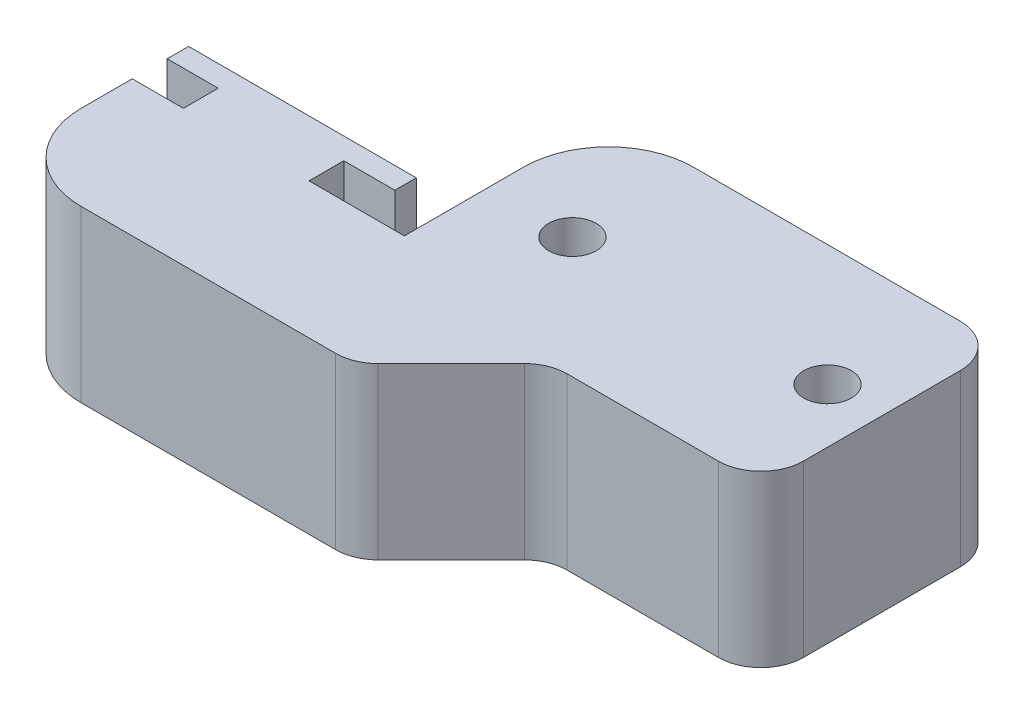
ISO-10303-21;
HEADER;
FILE_DESCRIPTION(('STEP AP214'),'2;1');
FILE_NAME('part.step','',(''),(''),'','','');
FILE_SCHEMA(('AUTOMOTIVE_DESIGN { 1 0 10303 214 1 1 1 1 }'));
ENDSEC;
DATA;
#1=APPLICATION_CONTEXT('core data for automotive mechanical design processes');
#2=APPLICATION_PROTOCOL_DEFINITION('international standard','automotive_design',2000,#1);
#3=PRODUCT_CONTEXT('',#1,'mechanical');
#4=PRODUCT('Part','Part','',(#3));
#5=PRODUCT_RELATED_PRODUCT_CATEGORY('part','',(#4));
#6=PRODUCT_DEFINITION_FORMATION('','',#4);
#7=PRODUCT_DEFINITION_CONTEXT('part definition',#1,'design');
#8=PRODUCT_DEFINITION('design','',#6,#7);
#9=PRODUCT_DEFINITION_SHAPE('','',#8);
#10=(LENGTH_UNIT() NAMED_UNIT(*) SI_UNIT(.MILLI.,.METRE.));
#11=(NAMED_UNIT(*) PLANE_ANGLE_UNIT() SI_UNIT($,.RADIAN.));
#12=(NAMED_UNIT(*) SI_UNIT($,.STERADIAN.) SOLID_ANGLE_UNIT());
#13=UNCERTAINTY_MEASURE_WITH_UNIT(LENGTH_MEASURE(1.E-05),#10,'distance_accuracy_value','');
#14=(GEOMETRIC_REPRESENTATION_CONTEXT(3) GLOBAL_UNCERTAINTY_ASSIGNED_CONTEXT((#13)) GLOBAL_UNIT_ASSIGNED_CONTEXT((#10,
#11,#12)) REPRESENTATION_CONTEXT('',''));
#15=CARTESIAN_POINT('',(0.,0.,0.));
#16=DIRECTION('',(0.,0.,1.));
#17=DIRECTION('',(1.,0.,0.));
#18=AXIS2_PLACEMENT_3D('',#15,#16,#17);
#19=CARTESIAN_POINT('',(-22.4210050080891,6.35,-2.9181600674867));
#20=DIRECTION('',(0.,1.,0.));
#21=DIRECTION('',(0.,0.,1.));
#22=AXIS2_PLACEMENT_3D('',#19,#20,#21);
#23=PLANE('',#22);
#24=CARTESIAN_POINT('',(-32.3905050080891,6.35,-5.85066017148669));
#25=DIRECTION('',(0.,1.,0.));
#26=DIRECTION('',(0.,0.,1.));
#27=AXIS2_PLACEMENT_3D('',#24,#25,#26);
#28=CIRCLE('',#27,0.889000000000003);
#29=CARTESIAN_POINT('',(-32.3905050080891,6.35,-4.96166017148668));
#30=VERTEX_POINT('',#29);
#31=EDGE_CURVE('E217',#30,#30,#28,.T.);
#32=ORIENTED_EDGE('',*,*,#31,.F.);
#33=EDGE_LOOP('',(#32));
#34=FACE_BOUND('',#33,.T.);
#35=CARTESIAN_POINT('',(-22.4210050080891,6.35,-2.9181600674867));
#36=DIRECTION('',(0.,1.,0.));
#37=DIRECTION('',(0.,0.,1.));
#38=AXIS2_PLACEMENT_3D('',#35,#36,#37);
#39=CIRCLE('',#38,1.5875);
#40=CARTESIAN_POINT('',(-22.4210050080891,6.35,-1.3306600674867));
#41=VERTEX_POINT('',#40);
#42=CARTESIAN_POINT('',(-20.8335050080891,6.35,-2.9181600674867));
#43=VERTEX_POINT('',#42);
#44=EDGE_CURVE('E256',#41,#43,#39,.T.);
#45=ORIENTED_EDGE('',*,*,#44,.T.);
#46=DIRECTION('',(0.,0.,-1.));
#47=VECTOR('',#46,1.);
#48=CARTESIAN_POINT('',(-20.8335050080891,6.35,-2.9181600674867));
#49=LINE('',#48,#47);
#50=CARTESIAN_POINT('',(-20.8335050080891,6.35,-8.7831601714867));
#51=VERTEX_POINT('',#50);
#52=EDGE_CURVE('E134',#43,#51,#49,.T.);
#53=ORIENTED_EDGE('',*,*,#52,.T.);
#54=CARTESIAN_POINT('',(-22.4210050080891,6.35,-8.7831601714867));
#55=DIRECTION('',(0.,1.,0.));
#56=DIRECTION('',(0.,0.,1.));
#57=AXIS2_PLACEMENT_3D('',#54,#55,#56);
#58=CIRCLE('',#57,1.5875);
#59=CARTESIAN_POINT('',(-22.4210050080891,6.35,-10.3706601714867));
#60=VERTEX_POINT('',#59);
#61=EDGE_CURVE('E313',#51,#60,#58,.T.);
#62=ORIENTED_EDGE('',*,*,#61,.T.);
#63=DIRECTION('',(-1.,0.,0.));
#64=VECTOR('',#63,1.);
#65=CARTESIAN_POINT('',(-32.3905050080891,6.35,-10.3706601714867));
#66=LINE('',#65,#64);
#67=CARTESIAN_POINT('',(-32.3905050080891,6.35,-10.3706601714867));
#68=VERTEX_POINT('',#67);
#69=EDGE_CURVE('E332',#60,#68,#66,.T.);
#70=ORIENTED_EDGE('',*,*,#69,.T.);
#71=CARTESIAN_POINT('',(-32.3905050080891,6.35,-7.19566017148671));
#72=DIRECTION('',(0.,1.,0.));
#73=DIRECTION('',(0.,0.,1.));
#74=AXIS2_PLACEMENT_3D('',#71,#72,#73);
#75=CIRCLE('',#74,3.175);
#76=CARTESIAN_POINT('',(-35.5655050080891,6.35,-7.19566017148671));
#77=VERTEX_POINT('',#76);
#78=EDGE_CURVE('E329',#68,#77,#75,.T.);
#79=ORIENTED_EDGE('',*,*,#78,.T.);
#80=DIRECTION('',(0.,0.,1.));
#81=VECTOR('',#80,1.);
#82=CARTESIAN_POINT('',(-35.5655050080891,6.35,-7.19566017148671));
#83=LINE('',#82,#81);
#84=CARTESIAN_POINT('',(-35.5655050080891,6.35,-2.7506601714867));
#85=VERTEX_POINT('',#84);
#86=EDGE_CURVE('E331',#77,#85,#83,.T.);
#87=ORIENTED_EDGE('',*,*,#86,.T.);
#88=DIRECTION('',(-1.,0.,0.));
#89=VECTOR('',#88,1.);
#90=CARTESIAN_POINT('',(-35.5655050080891,6.35,-2.7506601714867));
#91=LINE('',#90,#89);
#92=CARTESIAN_POINT('',(-39.1255050080891,6.35,-2.7506601714867));
#93=VERTEX_POINT('',#92);
#94=EDGE_CURVE('E334',#85,#93,#91,.T.);
#95=ORIENTED_EDGE('',*,*,#94,.T.);
#96=DIRECTION('',(0.,0.,-1.));
#97=VECTOR('',#96,1.);
#98=CARTESIAN_POINT('',(-39.1255050080891,6.35,-2.7506601714867));
#99=LINE('',#98,#97);
#100=CARTESIAN_POINT('',(-39.1255050080891,6.35,-4.0506601714867));
#101=VERTEX_POINT('',#100);
#102=EDGE_CURVE('E340',#93,#101,#99,.T.);
#103=ORIENTED_EDGE('',*,*,#102,.T.);
#104=DIRECTION('',(1.,0.,0.));
#105=VECTOR('',#104,1.);
#106=CARTESIAN_POINT('',(-37.2205050080891,6.35,-4.0506601714867));
#107=LINE('',#106,#105);
#108=CARTESIAN_POINT('',(-37.2205050080891,6.35,-4.0506601714867));
#109=VERTEX_POINT('',#108);
#110=EDGE_CURVE('E342',#101,#109,#107,.T.);
#111=ORIENTED_EDGE('',*,*,#110,.T.);
#112=DIRECTION('',(0.,0.,-1.));
#113=VECTOR('',#112,1.);
#114=CARTESIAN_POINT('',(-37.2205050080891,6.35,-4.0506601714867));
#115=LINE('',#114,#113);
#116=CARTESIAN_POINT('',(-37.2205050080891,6.35,-4.8506601714867));
#117=VERTEX_POINT('',#116);
#118=EDGE_CURVE('E344',#109,#117,#115,.T.);
#119=ORIENTED_EDGE('',*,*,#118,.T.);
#120=DIRECTION('',(-1.,0.,0.));
#121=VECTOR('',#120,1.);
#122=CARTESIAN_POINT('',(-37.2205050080891,6.35,-4.8506601714867));
#123=LINE('',#122,#121);
#124=CARTESIAN_POINT('',(-45.7205050080891,6.35,-4.8506601714867));
#125=VERTEX_POINT('',#124);
#126=EDGE_CURVE('E346',#117,#125,#123,.T.);
#127=ORIENTED_EDGE('',*,*,#126,.T.);
#128=DIRECTION('',(0.,0.,1.));
#129=VECTOR('',#128,1.);
#130=CARTESIAN_POINT('',(-45.7205050080891,6.35,-4.0506601714867));
#131=LINE('',#130,#129);
#132=CARTESIAN_POINT('',(-45.7205050080891,6.35,-4.0506601714867));
#133=VERTEX_POINT('',#132);
#134=EDGE_CURVE('E348',#125,#133,#131,.T.);
#135=ORIENTED_EDGE('',*,*,#134,.T.);
#136=DIRECTION('',(1.,0.,0.));
#137=VECTOR('',#136,1.);
#138=CARTESIAN_POINT('',(-43.8155050080891,6.35,-4.0506601714867));
#139=LINE('',#138,#137);
#140=CARTESIAN_POINT('',(-43.8155050080891,6.35,-4.0506601714867));
#141=VERTEX_POINT('',#140);
#142=EDGE_CURVE('E350',#133,#141,#139,.T.);
#143=ORIENTED_EDGE('',*,*,#142,.T.);
#144=DIRECTION('',(0.,0.,1.));
#145=VECTOR('',#144,1.);
#146=CARTESIAN_POINT('',(-43.8155050080891,6.35,-2.7506601714867));
#147=LINE('',#146,#145);
#148=CARTESIAN_POINT('',(-43.8155050080891,6.35,-2.7506601714867));
#149=VERTEX_POINT('',#148);
#150=EDGE_CURVE('E352',#141,#149,#147,.T.);
#151=ORIENTED_EDGE('',*,*,#150,.T.);
#152=DIRECTION('',(-1.,0.,0.));
#153=VECTOR('',#152,1.);
#154=CARTESIAN_POINT('',(-43.8155050080891,6.35,-2.7506601714867));
#155=LINE('',#154,#153);
#156=CARTESIAN_POINT('',(-45.7255050080891,6.35,-2.7506601714867));
#157=VERTEX_POINT('',#156);
#158=EDGE_CURVE('E354',#149,#157,#155,.T.);
#159=ORIENTED_EDGE('',*,*,#158,.T.);
#160=DIRECTION('',(0.,0.,1.));
#161=VECTOR('',#160,1.);
#162=CARTESIAN_POINT('',(-45.7255050080891,6.35,-0.84566017148672));
#163=LINE('',#162,#161);
#164=CARTESIAN_POINT('',(-45.7255050080891,6.35,-0.84566017148672));
#165=VERTEX_POINT('',#164);
#166=EDGE_CURVE('E356',#157,#165,#163,.T.);
#167=ORIENTED_EDGE('',*,*,#166,.T.);
#168=CARTESIAN_POINT('',(-42.5505050080891,6.35,-0.845660171486698));
#169=DIRECTION('',(0.,1.,0.));
#170=DIRECTION('',(0.,0.,-1.));
#171=AXIS2_PLACEMENT_3D('',#168,#169,#170);
#172=CIRCLE('',#171,3.175);
#173=CARTESIAN_POINT('',(-42.5505050080891,6.35,2.3293398285133));
#174=VERTEX_POINT('',#173);
#175=EDGE_CURVE('E358',#165,#174,#172,.T.);
#176=ORIENTED_EDGE('',*,*,#175,.T.);
#177=DIRECTION('',(1.,0.,0.));
#178=VECTOR('',#177,1.);
#179=CARTESIAN_POINT('',(-33.0480690383564,6.35,2.3293398285133));
#180=LINE('',#179,#178);
#181=CARTESIAN_POINT('',(-33.0480690383564,6.35,2.3293398285133));
#182=VERTEX_POINT('',#181);
#183=EDGE_CURVE('E360',#174,#182,#180,.T.);
#184=ORIENTED_EDGE('',*,*,#183,.T.);
#185=CARTESIAN_POINT('',(-33.0480690383564,6.35,0.741839828513301));
#186=DIRECTION('',(0.,1.,0.));
#187=DIRECTION('',(0.,0.,-1.));
#188=AXIS2_PLACEMENT_3D('',#185,#186,#187);
#189=CIRCLE('',#188,1.5875);
#190=CARTESIAN_POINT('',(-31.9255370232227,6.35,1.86437184364694));
#191=VERTEX_POINT('',#190);
#192=EDGE_CURVE('E195',#182,#191,#189,.T.);
#193=ORIENTED_EDGE('',*,*,#192,.T.);
#194=DIRECTION('',(0.707106781186546,0.,-0.707106781186549));
#195=VECTOR('',#194,1.);
#196=CARTESIAN_POINT('',(-29.1954730969554,6.35,-0.865692082620341));
#197=LINE('',#196,#195);
#198=CARTESIAN_POINT('',(-29.1954730969554,6.35,-0.86569208262034));
#199=VERTEX_POINT('',#198);
#200=EDGE_CURVE('E189',#191,#199,#197,.T.);
#201=ORIENTED_EDGE('',*,*,#200,.T.);
#202=CARTESIAN_POINT('',(-28.0729410818218,6.35,0.256839932513303));
#203=DIRECTION('',(0.,-1.,0.));
#204=DIRECTION('',(0.,0.,-1.));
#205=AXIS2_PLACEMENT_3D('',#202,#203,#204);
#206=CIRCLE('',#205,1.5875);
#207=CARTESIAN_POINT('',(-28.0729410818218,6.35,-1.3306600674867));
#208=VERTEX_POINT('',#207);
#209=EDGE_CURVE('E193',#199,#208,#206,.T.);
#210=ORIENTED_EDGE('',*,*,#209,.T.);
#211=DIRECTION('',(1.,0.,0.));
#212=VECTOR('',#211,1.);
#213=CARTESIAN_POINT('',(-22.4210050080891,6.35,-1.3306600674867));
#214=LINE('',#213,#212);
#215=EDGE_CURVE('E49',#208,#41,#214,.T.);
#216=ORIENTED_EDGE('',*,*,#215,.T.);
#217=EDGE_LOOP('',(#45,#53,#62,#70,#79,#87,#95,#103,#111,#119,#127,#135,#143,#151,#159,#167,
#176,#184,#193,#201,#210,#216));
#218=FACE_BOUND('',#217,.T.);
#219=CARTESIAN_POINT('',(-22.8655050080891,6.35,-5.8506601714867));
#220=DIRECTION('',(0.,1.,0.));
#221=DIRECTION('',(0.,0.,1.));
#222=AXIS2_PLACEMENT_3D('',#219,#220,#221);
#223=CIRCLE('',#222,0.889);
#224=CARTESIAN_POINT('',(-22.8655050080891,6.35,-4.9616601714867));
#225=VERTEX_POINT('',#224);
#226=EDGE_CURVE('E403',#225,#225,#223,.T.);
#227=ORIENTED_EDGE('',*,*,#226,.F.);
#228=EDGE_LOOP('',(#227));
#229=FACE_BOUND('',#228,.T.);
#230=ADVANCED_FACE('F32',(#34,#218,#229),#23,.T.);
#231=CARTESIAN_POINT('',(-22.4210050080891,0.,-2.9181600674867));
#232=DIRECTION('',(0.,1.,0.));
#233=DIRECTION('',(0.,0.,1.));
#234=AXIS2_PLACEMENT_3D('',#231,#232,#233);
#235=PLANE('',#234);
#236=CARTESIAN_POINT('',(-32.3905050080891,0.,-5.85066017148669));
#237=DIRECTION('',(0.,1.,0.));
#238=DIRECTION('',(0.,0.,1.));
#239=AXIS2_PLACEMENT_3D('',#236,#237,#238);
#240=CIRCLE('',#239,0.889000000000003);
#241=CARTESIAN_POINT('',(-32.3905050080891,0.,-4.96166017148668));
#242=VERTEX_POINT('',#241);
#243=EDGE_CURVE('E408',#242,#242,#240,.T.);
#244=ORIENTED_EDGE('',*,*,#243,.T.);
#245=EDGE_LOOP('',(#244));
#246=FACE_BOUND('',#245,.T.);
#247=CARTESIAN_POINT('',(-22.4210050080891,0.,-2.9181600674867));
#248=DIRECTION('',(0.,1.,0.));
#249=DIRECTION('',(0.,0.,1.));
#250=AXIS2_PLACEMENT_3D('',#247,#248,#249);
#251=CIRCLE('',#250,1.5875);
#252=CARTESIAN_POINT('',(-22.4210050080891,0.,-1.3306600674867));
#253=VERTEX_POINT('',#252);
#254=CARTESIAN_POINT('',(-20.8335050080891,0.,-2.9181600674867));
#255=VERTEX_POINT('',#254);
#256=EDGE_CURVE('E213',#253,#255,#251,.T.);
#257=ORIENTED_EDGE('',*,*,#256,.F.);
#258=DIRECTION('',(1.,0.,0.));
#259=VECTOR('',#258,1.);
#260=CARTESIAN_POINT('',(-22.4210050080891,0.,-1.3306600674867));
#261=LINE('',#260,#259);
#262=CARTESIAN_POINT('',(-28.0729410818218,0.,-1.3306600674867));
#263=VERTEX_POINT('',#262);
#264=EDGE_CURVE('E126',#263,#253,#261,.T.);
#265=ORIENTED_EDGE('',*,*,#264,.F.);
#266=CARTESIAN_POINT('',(-28.0729410818218,0.,0.256839932513303));
#267=DIRECTION('',(0.,-1.,0.));
#268=DIRECTION('',(0.,0.,-1.));
#269=AXIS2_PLACEMENT_3D('',#266,#267,#268);
#270=CIRCLE('',#269,1.5875);
#271=CARTESIAN_POINT('',(-29.1954730969554,0.,-0.86569208262034));
#272=VERTEX_POINT('',#271);
#273=EDGE_CURVE('E120',#272,#263,#270,.T.);
#274=ORIENTED_EDGE('',*,*,#273,.F.);
#275=DIRECTION('',(0.707106781186546,0.,-0.707106781186549));
#276=VECTOR('',#275,1.);
#277=CARTESIAN_POINT('',(-29.1954730969554,0.,-0.865692082620341));
#278=LINE('',#277,#276);
#279=CARTESIAN_POINT('',(-31.9255370232227,0.,1.86437184364694));
#280=VERTEX_POINT('',#279);
#281=EDGE_CURVE('E203',#280,#272,#278,.T.);
#282=ORIENTED_EDGE('',*,*,#281,.F.);
#283=CARTESIAN_POINT('',(-33.0480690383564,0.,0.741839828513301));
#284=DIRECTION('',(0.,1.,0.));
#285=DIRECTION('',(0.,0.,-1.));
#286=AXIS2_PLACEMENT_3D('',#283,#284,#285);
#287=CIRCLE('',#286,1.5875);
#288=CARTESIAN_POINT('',(-33.0480690383564,0.,2.3293398285133));
#289=VERTEX_POINT('',#288);
#290=EDGE_CURVE('E251',#289,#280,#287,.T.);
#291=ORIENTED_EDGE('',*,*,#290,.F.);
#292=DIRECTION('',(1.,0.,0.));
#293=VECTOR('',#292,1.);
#294=CARTESIAN_POINT('',(-33.0480690383564,0.,2.3293398285133));
#295=LINE('',#294,#293);
#296=CARTESIAN_POINT('',(-42.5505050080891,0.,2.3293398285133));
#297=VERTEX_POINT('',#296);
#298=EDGE_CURVE('E249',#297,#289,#295,.T.);
#299=ORIENTED_EDGE('',*,*,#298,.F.);
#300=CARTESIAN_POINT('',(-42.5505050080891,0.,-0.845660171486698));
#301=DIRECTION('',(0.,1.,0.));
#302=DIRECTION('',(0.,0.,-1.));
#303=AXIS2_PLACEMENT_3D('',#300,#301,#302);
#304=CIRCLE('',#303,3.175);
#305=CARTESIAN_POINT('',(-45.7255050080891,0.,-0.84566017148672));
#306=VERTEX_POINT('',#305);
#307=EDGE_CURVE('E247',#306,#297,#304,.T.);
#308=ORIENTED_EDGE('',*,*,#307,.F.);
#309=DIRECTION('',(0.,0.,1.));
#310=VECTOR('',#309,1.);
#311=CARTESIAN_POINT('',(-45.7255050080891,0.,-0.84566017148672));
#312=LINE('',#311,#310);
#313=CARTESIAN_POINT('',(-45.7255050080891,0.,-2.7506601714867));
#314=VERTEX_POINT('',#313);
#315=EDGE_CURVE('E245',#314,#306,#312,.T.);
#316=ORIENTED_EDGE('',*,*,#315,.F.);
#317=DIRECTION('',(-1.,0.,0.));
#318=VECTOR('',#317,1.);
#319=CARTESIAN_POINT('',(-43.8155050080891,0.,-2.7506601714867));
#320=LINE('',#319,#318);
#321=CARTESIAN_POINT('',(-43.8155050080891,0.,-2.7506601714867));
#322=VERTEX_POINT('',#321);
#323=EDGE_CURVE('E243',#322,#314,#320,.T.);
#324=ORIENTED_EDGE('',*,*,#323,.F.);
#325=DIRECTION('',(0.,0.,1.));
#326=VECTOR('',#325,1.);
#327=CARTESIAN_POINT('',(-43.8155050080891,0.,-2.7506601714867));
#328=LINE('',#327,#326);
#329=CARTESIAN_POINT('',(-43.8155050080891,0.,-4.0506601714867));
#330=VERTEX_POINT('',#329);
#331=EDGE_CURVE('E241',#330,#322,#328,.T.);
#332=ORIENTED_EDGE('',*,*,#331,.F.);
#333=DIRECTION('',(1.,0.,0.));
#334=VECTOR('',#333,1.);
#335=CARTESIAN_POINT('',(-43.8155050080891,0.,-4.0506601714867));
#336=LINE('',#335,#334);
#337=CARTESIAN_POINT('',(-45.7205050080891,0.,-4.0506601714867));
#338=VERTEX_POINT('',#337);
#339=EDGE_CURVE('E239',#338,#330,#336,.T.);
#340=ORIENTED_EDGE('',*,*,#339,.F.);
#341=DIRECTION('',(0.,0.,1.));
#342=VECTOR('',#341,1.);
#343=CARTESIAN_POINT('',(-45.7205050080891,0.,-4.0506601714867));
#344=LINE('',#343,#342);
#345=CARTESIAN_POINT('',(-45.7205050080891,0.,-4.8506601714867));
#346=VERTEX_POINT('',#345);
#347=EDGE_CURVE('E237',#346,#338,#344,.T.);
#348=ORIENTED_EDGE('',*,*,#347,.F.);
#349=DIRECTION('',(-1.,0.,0.));
#350=VECTOR('',#349,1.);
#351=CARTESIAN_POINT('',(-37.2205050080891,0.,-4.8506601714867));
#352=LINE('',#351,#350);
#353=CARTESIAN_POINT('',(-37.2205050080891,0.,-4.8506601714867));
#354=VERTEX_POINT('',#353);
#355=EDGE_CURVE('E235',#354,#346,#352,.T.);
#356=ORIENTED_EDGE('',*,*,#355,.F.);
#357=DIRECTION('',(0.,0.,-1.));
#358=VECTOR('',#357,1.);
#359=CARTESIAN_POINT('',(-37.2205050080891,0.,-4.0506601714867));
#360=LINE('',#359,#358);
#361=CARTESIAN_POINT('',(-37.2205050080891,0.,-4.0506601714867));
#362=VERTEX_POINT('',#361);
#363=EDGE_CURVE('E233',#362,#354,#360,.T.);
#364=ORIENTED_EDGE('',*,*,#363,.F.);
#365=DIRECTION('',(1.,0.,0.));
#366=VECTOR('',#365,1.);
#367=CARTESIAN_POINT('',(-37.2205050080891,0.,-4.0506601714867));
#368=LINE('',#367,#366);
#369=CARTESIAN_POINT('',(-39.1255050080891,0.,-4.0506601714867));
#370=VERTEX_POINT('',#369);
#371=EDGE_CURVE('E231',#370,#362,#368,.T.);
#372=ORIENTED_EDGE('',*,*,#371,.F.);
#373=DIRECTION('',(0.,0.,-1.));
#374=VECTOR('',#373,1.);
#375=CARTESIAN_POINT('',(-39.1255050080891,0.,-2.7506601714867));
#376=LINE('',#375,#374);
#377=CARTESIAN_POINT('',(-39.1255050080891,0.,-2.7506601714867));
#378=VERTEX_POINT('',#377);
#379=EDGE_CURVE('E229',#378,#370,#376,.T.);
#380=ORIENTED_EDGE('',*,*,#379,.F.);
#381=DIRECTION('',(-1.,0.,0.));
#382=VECTOR('',#381,1.);
#383=CARTESIAN_POINT('',(-35.5655050080891,0.,-2.7506601714867));
#384=LINE('',#383,#382);
#385=CARTESIAN_POINT('',(-35.5655050080891,0.,-2.7506601714867));
#386=VERTEX_POINT('',#385);
#387=EDGE_CURVE('E227',#386,#378,#384,.T.);
#388=ORIENTED_EDGE('',*,*,#387,.F.);
#389=DIRECTION('',(0.,0.,1.));
#390=VECTOR('',#389,1.);
#391=CARTESIAN_POINT('',(-35.5655050080891,0.,-7.19566017148671));
#392=LINE('',#391,#390);
#393=CARTESIAN_POINT('',(-35.5655050080891,0.,-7.19566017148671));
#394=VERTEX_POINT('',#393);
#395=EDGE_CURVE('E225',#394,#386,#392,.T.);
#396=ORIENTED_EDGE('',*,*,#395,.F.);
#397=CARTESIAN_POINT('',(-32.3905050080891,0.,-7.19566017148671));
#398=DIRECTION('',(0.,1.,0.));
#399=DIRECTION('',(0.,0.,1.));
#400=AXIS2_PLACEMENT_3D('',#397,#398,#399);
#401=CIRCLE('',#400,3.175);
#402=CARTESIAN_POINT('',(-32.3905050080891,0.,-10.3706601714867));
#403=VERTEX_POINT('',#402);
#404=EDGE_CURVE('E223',#403,#394,#401,.T.);
#405=ORIENTED_EDGE('',*,*,#404,.F.);
#406=DIRECTION('',(-1.,0.,0.));
#407=VECTOR('',#406,1.);
#408=CARTESIAN_POINT('',(-32.3905050080891,0.,-10.3706601714867));
#409=LINE('',#408,#407);
#410=CARTESIAN_POINT('',(-22.4210050080891,0.,-10.3706601714867));
#411=VERTEX_POINT('',#410);
#412=EDGE_CURVE('E221',#411,#403,#409,.T.);
#413=ORIENTED_EDGE('',*,*,#412,.F.);
#414=CARTESIAN_POINT('',(-22.4210050080891,0.,-8.7831601714867));
#415=DIRECTION('',(0.,1.,0.));
#416=DIRECTION('',(0.,0.,1.));
#417=AXIS2_PLACEMENT_3D('',#414,#415,#416);
#418=CIRCLE('',#417,1.5875);
#419=CARTESIAN_POINT('',(-20.8335050080891,0.,-8.7831601714867));
#420=VERTEX_POINT('',#419);
#421=EDGE_CURVE('E219',#420,#411,#418,.T.);
#422=ORIENTED_EDGE('',*,*,#421,.F.);
#423=DIRECTION('',(0.,0.,-1.));
#424=VECTOR('',#423,1.);
#425=CARTESIAN_POINT('',(-20.8335050080891,0.,-2.9181600674867));
#426=LINE('',#425,#424);
#427=EDGE_CURVE('E216',#255,#420,#426,.T.);
#428=ORIENTED_EDGE('',*,*,#427,.F.);
#429=EDGE_LOOP('',(#257,#265,#274,#282,#291,#299,#308,#316,#324,#332,#340,#348,#356,#364,#372,
#380,#388,#396,#405,#413,#422,#428));
#430=FACE_BOUND('',#429,.T.);
#431=CARTESIAN_POINT('',(-22.8655050080891,0.,-5.8506601714867));
#432=DIRECTION('',(0.,1.,0.));
#433=DIRECTION('',(0.,0.,1.));
#434=AXIS2_PLACEMENT_3D('',#431,#432,#433);
#435=CIRCLE('',#434,0.889);
#436=CARTESIAN_POINT('',(-22.8655050080891,0.,-4.9616601714867));
#437=VERTEX_POINT('',#436);
#438=EDGE_CURVE('E406',#437,#437,#435,.T.);
#439=ORIENTED_EDGE('',*,*,#438,.T.);
#440=EDGE_LOOP('',(#439));
#441=FACE_BOUND('',#440,.T.);
#442=ADVANCED_FACE('F317',(#246,#430,#441),#235,.F.);
#443=CARTESIAN_POINT('',(-22.4210050080891,6.35,-2.9181600674867));
#444=DIRECTION('',(0.,-1.,0.));
#445=DIRECTION('',(0.,0.,-1.));
#446=AXIS2_PLACEMENT_3D('',#443,#444,#445);
#447=CYLINDRICAL_SURFACE('',#446,1.5875);
#448=ORIENTED_EDGE('',*,*,#256,.T.);
#449=DIRECTION('',(0.,-1.,0.));
#450=VECTOR('',#449,1.);
#451=CARTESIAN_POINT('',(-20.8335050080891,6.35,-2.9181600674867));
#452=LINE('',#451,#450);
#453=EDGE_CURVE('E11',#43,#255,#452,.T.);
#454=ORIENTED_EDGE('',*,*,#453,.F.);
#455=ORIENTED_EDGE('',*,*,#44,.F.);
#456=DIRECTION('',(0.,-1.,0.));
#457=VECTOR('',#456,1.);
#458=CARTESIAN_POINT('',(-22.4210050080891,6.35,-1.3306600674867));
#459=LINE('',#458,#457);
#460=EDGE_CURVE('E209',#41,#253,#459,.T.);
#461=ORIENTED_EDGE('',*,*,#460,.T.);
#462=EDGE_LOOP('',(#448,#454,#455,#461));
#463=FACE_BOUND('',#462,.T.);
#464=ADVANCED_FACE('F34',(#463),#447,.T.);
#465=CARTESIAN_POINT('',(-20.8335050080891,6.35,-2.9181600674867));
#466=DIRECTION('',(-1.,0.,0.));
#467=DIRECTION('',(0.,0.,1.));
#468=AXIS2_PLACEMENT_3D('',#465,#466,#467);
#469=PLANE('',#468);
#470=ORIENTED_EDGE('',*,*,#427,.T.);
#471=DIRECTION('',(0.,-1.,0.));
#472=VECTOR('',#471,1.);
#473=CARTESIAN_POINT('',(-20.8335050080891,6.35,-8.7831601714867));
#474=LINE('',#473,#472);
#475=EDGE_CURVE('E41',#51,#420,#474,.T.);
#476=ORIENTED_EDGE('',*,*,#475,.F.);
#477=ORIENTED_EDGE('',*,*,#52,.F.);
#478=ORIENTED_EDGE('',*,*,#453,.T.);
#479=EDGE_LOOP('',(#470,#476,#477,#478));
#480=FACE_BOUND('',#479,.T.);
#481=ADVANCED_FACE('F601',(#480),#469,.F.);
#482=CARTESIAN_POINT('',(-22.4210050080891,6.35,-8.7831601714867));
#483=DIRECTION('',(0.,-1.,0.));
#484=DIRECTION('',(0.,0.,-1.));
#485=AXIS2_PLACEMENT_3D('',#482,#483,#484);
#486=CYLINDRICAL_SURFACE('',#485,1.5875);
#487=ORIENTED_EDGE('',*,*,#421,.T.);
#488=DIRECTION('',(0.,-1.,0.));
#489=VECTOR('',#488,1.);
#490=CARTESIAN_POINT('',(-22.4210050080891,6.35,-10.3706601714867));
#491=LINE('',#490,#489);
#492=EDGE_CURVE('E305',#60,#411,#491,.T.);
#493=ORIENTED_EDGE('',*,*,#492,.F.);
#494=ORIENTED_EDGE('',*,*,#61,.F.);
#495=ORIENTED_EDGE('',*,*,#475,.T.);
#496=EDGE_LOOP('',(#487,#493,#494,#495));
#497=FACE_BOUND('',#496,.T.);
#498=ADVANCED_FACE('F311',(#497),#486,.T.);
#499=CARTESIAN_POINT('',(-32.3905050080891,6.35,-10.3706601714867));
#500=DIRECTION('',(0.,0.,1.));
#501=DIRECTION('',(1.,0.,0.));
#502=AXIS2_PLACEMENT_3D('',#499,#500,#501);
#503=PLANE('',#502);
#504=ORIENTED_EDGE('',*,*,#412,.T.);
#505=DIRECTION('',(0.,-1.,0.));
#506=VECTOR('',#505,1.);
#507=CARTESIAN_POINT('',(-32.3905050080891,6.35,-10.3706601714867));
#508=LINE('',#507,#506);
#509=EDGE_CURVE('E302',#68,#403,#508,.T.);
#510=ORIENTED_EDGE('',*,*,#509,.F.);
#511=ORIENTED_EDGE('',*,*,#69,.F.);
#512=ORIENTED_EDGE('',*,*,#492,.T.);
#513=EDGE_LOOP('',(#504,#510,#511,#512));
#514=FACE_BOUND('',#513,.T.);
#515=ADVANCED_FACE('F323',(#514),#503,.F.);
#516=CARTESIAN_POINT('',(-32.3905050080891,6.35,-7.19566017148671));
#517=DIRECTION('',(0.,-1.,0.));
#518=DIRECTION('',(0.,0.,-1.));
#519=AXIS2_PLACEMENT_3D('',#516,#517,#518);
#520=CYLINDRICAL_SURFACE('',#519,3.175);
#521=ORIENTED_EDGE('',*,*,#404,.T.);
#522=DIRECTION('',(0.,-1.,0.));
#523=VECTOR('',#522,1.);
#524=CARTESIAN_POINT('',(-35.5655050080891,6.35,-7.19566017148671));
#525=LINE('',#524,#523);
#526=EDGE_CURVE('E299',#77,#394,#525,.T.);
#527=ORIENTED_EDGE('',*,*,#526,.F.);
#528=ORIENTED_EDGE('',*,*,#78,.F.);
#529=ORIENTED_EDGE('',*,*,#509,.T.);
#530=EDGE_LOOP('',(#521,#527,#528,#529));
#531=FACE_BOUND('',#530,.T.);
#532=ADVANCED_FACE('F327',(#531),#520,.T.);
#533=CARTESIAN_POINT('',(-35.5655050080891,6.35,-7.19566017148671));
#534=DIRECTION('',(1.,0.,0.));
#535=DIRECTION('',(0.,0.,-1.));
#536=AXIS2_PLACEMENT_3D('',#533,#534,#535);
#537=PLANE('',#536);
#538=ORIENTED_EDGE('',*,*,#395,.T.);
#539=DIRECTION('',(0.,-1.,0.));
#540=VECTOR('',#539,1.);
#541=CARTESIAN_POINT('',(-35.5655050080891,6.35,-2.7506601714867));
#542=LINE('',#541,#540);
#543=EDGE_CURVE('E296',#85,#386,#542,.T.);
#544=ORIENTED_EDGE('',*,*,#543,.F.);
#545=ORIENTED_EDGE('',*,*,#86,.F.);
#546=ORIENTED_EDGE('',*,*,#526,.T.);
#547=EDGE_LOOP('',(#538,#544,#545,#546));
#548=FACE_BOUND('',#547,.T.);
#549=ADVANCED_FACE('F566',(#548),#537,.F.);
#550=CARTESIAN_POINT('',(-35.5655050080891,6.35,-2.7506601714867));
#551=DIRECTION('',(0.,0.,1.));
#552=DIRECTION('',(1.,0.,0.));
#553=AXIS2_PLACEMENT_3D('',#550,#551,#552);
#554=PLANE('',#553);
#555=ORIENTED_EDGE('',*,*,#387,.T.);
#556=DIRECTION('',(0.,-1.,0.));
#557=VECTOR('',#556,1.);
#558=CARTESIAN_POINT('',(-39.1255050080891,6.35,-2.7506601714867));
#559=LINE('',#558,#557);
#560=EDGE_CURVE('E293',#93,#378,#559,.T.);
#561=ORIENTED_EDGE('',*,*,#560,.F.);
#562=ORIENTED_EDGE('',*,*,#94,.F.);
#563=ORIENTED_EDGE('',*,*,#543,.T.);
#564=EDGE_LOOP('',(#555,#561,#562,#563));
#565=FACE_BOUND('',#564,.T.);
#566=ADVANCED_FACE('F556',(#565),#554,.F.);
#567=CARTESIAN_POINT('',(-39.1255050080891,6.35,-2.7506601714867));
#568=DIRECTION('',(-1.,0.,0.));
#569=DIRECTION('',(0.,0.,1.));
#570=AXIS2_PLACEMENT_3D('',#567,#568,#569);
#571=PLANE('',#570);
#572=ORIENTED_EDGE('',*,*,#379,.T.);
#573=DIRECTION('',(0.,-1.,0.));
#574=VECTOR('',#573,1.);
#575=CARTESIAN_POINT('',(-39.1255050080891,6.35,-4.0506601714867));
#576=LINE('',#575,#574);
#577=EDGE_CURVE('E290',#101,#370,#576,.T.);
#578=ORIENTED_EDGE('',*,*,#577,.F.);
#579=ORIENTED_EDGE('',*,*,#102,.F.);
#580=ORIENTED_EDGE('',*,*,#560,.T.);
#581=EDGE_LOOP('',(#572,#578,#579,#580));
#582=FACE_BOUND('',#581,.T.);
#583=ADVANCED_FACE('F546',(#582),#571,.F.);
#584=CARTESIAN_POINT('',(-37.2205050080891,6.35,-4.0506601714867));
#585=DIRECTION('',(0.,0.,-1.));
#586=DIRECTION('',(-1.,0.,0.));
#587=AXIS2_PLACEMENT_3D('',#584,#585,#586);
#588=PLANE('',#587);
#589=ORIENTED_EDGE('',*,*,#371,.T.);
#590=DIRECTION('',(0.,-1.,0.));
#591=VECTOR('',#590,1.);
#592=CARTESIAN_POINT('',(-37.2205050080891,6.35,-4.0506601714867));
#593=LINE('',#592,#591);
#594=EDGE_CURVE('E287',#109,#362,#593,.T.);
#595=ORIENTED_EDGE('',*,*,#594,.F.);
#596=ORIENTED_EDGE('',*,*,#110,.F.);
#597=ORIENTED_EDGE('',*,*,#577,.T.);
#598=EDGE_LOOP('',(#589,#595,#596,#597));
#599=FACE_BOUND('',#598,.T.);
#600=ADVANCED_FACE('F536',(#599),#588,.F.);
#601=CARTESIAN_POINT('',(-37.2205050080891,6.35,-4.0506601714867));
#602=DIRECTION('',(-1.,0.,0.));
#603=DIRECTION('',(0.,0.,1.));
#604=AXIS2_PLACEMENT_3D('',#601,#602,#603);
#605=PLANE('',#604);
#606=ORIENTED_EDGE('',*,*,#363,.T.);
#607=DIRECTION('',(0.,-1.,0.));
#608=VECTOR('',#607,1.);
#609=CARTESIAN_POINT('',(-37.2205050080891,6.35,-4.8506601714867));
#610=LINE('',#609,#608);
#611=EDGE_CURVE('E284',#117,#354,#610,.T.);
#612=ORIENTED_EDGE('',*,*,#611,.F.);
#613=ORIENTED_EDGE('',*,*,#118,.F.);
#614=ORIENTED_EDGE('',*,*,#594,.T.);
#615=EDGE_LOOP('',(#606,#612,#613,#614));
#616=FACE_BOUND('',#615,.T.);
#617=ADVANCED_FACE('F526',(#616),#605,.F.);
#618=CARTESIAN_POINT('',(-37.2205050080891,6.35,-4.8506601714867));
#619=DIRECTION('',(0.,0.,1.));
#620=DIRECTION('',(1.,0.,0.));
#621=AXIS2_PLACEMENT_3D('',#618,#619,#620);
#622=PLANE('',#621);
#623=ORIENTED_EDGE('',*,*,#355,.T.);
#624=DIRECTION('',(0.,-1.,0.));
#625=VECTOR('',#624,1.);
#626=CARTESIAN_POINT('',(-45.7205050080891,6.35,-4.8506601714867));
#627=LINE('',#626,#625);
#628=EDGE_CURVE('E281',#125,#346,#627,.T.);
#629=ORIENTED_EDGE('',*,*,#628,.F.);
#630=ORIENTED_EDGE('',*,*,#126,.F.);
#631=ORIENTED_EDGE('',*,*,#611,.T.);
#632=EDGE_LOOP('',(#623,#629,#630,#631));
#633=FACE_BOUND('',#632,.T.);
#634=ADVANCED_FACE('F516',(#633),#622,.F.);
#635=CARTESIAN_POINT('',(-45.7205050080891,6.35,-4.0506601714867));
#636=DIRECTION('',(1.,0.,0.));
#637=DIRECTION('',(0.,0.,-1.));
#638=AXIS2_PLACEMENT_3D('',#635,#636,#637);
#639=PLANE('',#638);
#640=ORIENTED_EDGE('',*,*,#347,.T.);
#641=DIRECTION('',(0.,-1.,0.));
#642=VECTOR('',#641,1.);
#643=CARTESIAN_POINT('',(-45.7205050080891,6.35,-4.0506601714867));
#644=LINE('',#643,#642);
#645=EDGE_CURVE('E278',#133,#338,#644,.T.);
#646=ORIENTED_EDGE('',*,*,#645,.F.);
#647=ORIENTED_EDGE('',*,*,#134,.F.);
#648=ORIENTED_EDGE('',*,*,#628,.T.);
#649=EDGE_LOOP('',(#640,#646,#647,#648));
#650=FACE_BOUND('',#649,.T.);
#651=ADVANCED_FACE('F506',(#650),#639,.F.);
#652=CARTESIAN_POINT('',(-43.8155050080891,6.35,-4.0506601714867));
#653=DIRECTION('',(0.,0.,-1.));
#654=DIRECTION('',(-1.,0.,0.));
#655=AXIS2_PLACEMENT_3D('',#652,#653,#654);
#656=PLANE('',#655);
#657=ORIENTED_EDGE('',*,*,#339,.T.);
#658=DIRECTION('',(0.,-1.,0.));
#659=VECTOR('',#658,1.);
#660=CARTESIAN_POINT('',(-43.8155050080891,6.35,-4.0506601714867));
#661=LINE('',#660,#659);
#662=EDGE_CURVE('E275',#141,#330,#661,.T.);
#663=ORIENTED_EDGE('',*,*,#662,.F.);
#664=ORIENTED_EDGE('',*,*,#142,.F.);
#665=ORIENTED_EDGE('',*,*,#645,.T.);
#666=EDGE_LOOP('',(#657,#663,#664,#665));
#667=FACE_BOUND('',#666,.T.);
#668=ADVANCED_FACE('F496',(#667),#656,.F.);
#669=CARTESIAN_POINT('',(-43.8155050080891,6.35,-2.7506601714867));
#670=DIRECTION('',(1.,0.,0.));
#671=DIRECTION('',(0.,0.,-1.));
#672=AXIS2_PLACEMENT_3D('',#669,#670,#671);
#673=PLANE('',#672);
#674=ORIENTED_EDGE('',*,*,#331,.T.);
#675=DIRECTION('',(0.,-1.,0.));
#676=VECTOR('',#675,1.);
#677=CARTESIAN_POINT('',(-43.8155050080891,6.35,-2.7506601714867));
#678=LINE('',#677,#676);
#679=EDGE_CURVE('E272',#149,#322,#678,.T.);
#680=ORIENTED_EDGE('',*,*,#679,.F.);
#681=ORIENTED_EDGE('',*,*,#150,.F.);
#682=ORIENTED_EDGE('',*,*,#662,.T.);
#683=EDGE_LOOP('',(#674,#680,#681,#682));
#684=FACE_BOUND('',#683,.T.);
#685=ADVANCED_FACE('F486',(#684),#673,.F.);
#686=CARTESIAN_POINT('',(-43.8155050080891,6.35,-2.7506601714867));
#687=DIRECTION('',(0.,0.,1.));
#688=DIRECTION('',(1.,0.,0.));
#689=AXIS2_PLACEMENT_3D('',#686,#687,#688);
#690=PLANE('',#689);
#691=ORIENTED_EDGE('',*,*,#323,.T.);
#692=DIRECTION('',(0.,-1.,0.));
#693=VECTOR('',#692,1.);
#694=CARTESIAN_POINT('',(-45.7255050080891,6.35,-2.7506601714867));
#695=LINE('',#694,#693);
#696=EDGE_CURVE('E269',#157,#314,#695,.T.);
#697=ORIENTED_EDGE('',*,*,#696,.F.);
#698=ORIENTED_EDGE('',*,*,#158,.F.);
#699=ORIENTED_EDGE('',*,*,#679,.T.);
#700=EDGE_LOOP('',(#691,#697,#698,#699));
#701=FACE_BOUND('',#700,.T.);
#702=ADVANCED_FACE('F476',(#701),#690,.F.);
#703=CARTESIAN_POINT('',(-45.7255050080891,6.35,-0.84566017148672));
#704=DIRECTION('',(1.,0.,0.));
#705=DIRECTION('',(0.,0.,-1.));
#706=AXIS2_PLACEMENT_3D('',#703,#704,#705);
#707=PLANE('',#706);
#708=ORIENTED_EDGE('',*,*,#315,.T.);
#709=DIRECTION('',(0.,-1.,0.));
#710=VECTOR('',#709,1.);
#711=CARTESIAN_POINT('',(-45.7255050080891,6.35,-0.84566017148672));
#712=LINE('',#711,#710);
#713=EDGE_CURVE('E266',#165,#306,#712,.T.);
#714=ORIENTED_EDGE('',*,*,#713,.F.);
#715=ORIENTED_EDGE('',*,*,#166,.F.);
#716=ORIENTED_EDGE('',*,*,#696,.T.);
#717=EDGE_LOOP('',(#708,#714,#715,#716));
#718=FACE_BOUND('',#717,.T.);
#719=ADVANCED_FACE('F466',(#718),#707,.F.);
#720=CARTESIAN_POINT('',(-42.5505050080891,6.35,-0.845660171486698));
#721=DIRECTION('',(0.,-1.,0.));
#722=DIRECTION('',(0.,0.,-1.));
#723=AXIS2_PLACEMENT_3D('',#720,#721,#722);
#724=CYLINDRICAL_SURFACE('',#723,3.175);
#725=ORIENTED_EDGE('',*,*,#307,.T.);
#726=DIRECTION('',(0.,-1.,0.));
#727=VECTOR('',#726,1.);
#728=CARTESIAN_POINT('',(-42.5505050080891,6.35,2.3293398285133));
#729=LINE('',#728,#727);
#730=EDGE_CURVE('E263',#174,#297,#729,.T.);
#731=ORIENTED_EDGE('',*,*,#730,.F.);
#732=ORIENTED_EDGE('',*,*,#175,.F.);
#733=ORIENTED_EDGE('',*,*,#713,.T.);
#734=EDGE_LOOP('',(#725,#731,#732,#733));
#735=FACE_BOUND('',#734,.T.);
#736=ADVANCED_FACE('F457',(#735),#724,.T.);
#737=CARTESIAN_POINT('',(-33.0480690383564,6.35,2.3293398285133));
#738=DIRECTION('',(0.,0.,-1.));
#739=DIRECTION('',(-1.,0.,0.));
#740=AXIS2_PLACEMENT_3D('',#737,#738,#739);
#741=PLANE('',#740);
#742=ORIENTED_EDGE('',*,*,#298,.T.);
#743=DIRECTION('',(0.,-1.,0.));
#744=VECTOR('',#743,1.);
#745=CARTESIAN_POINT('',(-33.0480690383564,6.35,2.3293398285133));
#746=LINE('',#745,#744);
#747=EDGE_CURVE('E260',#182,#289,#746,.T.);
#748=ORIENTED_EDGE('',*,*,#747,.F.);
#749=ORIENTED_EDGE('',*,*,#183,.F.);
#750=ORIENTED_EDGE('',*,*,#730,.T.);
#751=EDGE_LOOP('',(#742,#748,#749,#750));
#752=FACE_BOUND('',#751,.T.);
#753=ADVANCED_FACE('F366',(#752),#741,.F.);
#754=CARTESIAN_POINT('',(-33.0480690383564,6.35,0.741839828513301));
#755=DIRECTION('',(0.,-1.,0.));
#756=DIRECTION('',(0.,0.,-1.));
#757=AXIS2_PLACEMENT_3D('',#754,#755,#756);
#758=CYLINDRICAL_SURFACE('',#757,1.5875);
#759=ORIENTED_EDGE('',*,*,#290,.T.);
#760=DIRECTION('',(0.,-1.,0.));
#761=VECTOR('',#760,1.);
#762=CARTESIAN_POINT('',(-31.9255370232227,6.35,1.86437184364694));
#763=LINE('',#762,#761);
#764=EDGE_CURVE('E204',#191,#280,#763,.T.);
#765=ORIENTED_EDGE('',*,*,#764,.F.);
#766=ORIENTED_EDGE('',*,*,#192,.F.);
#767=ORIENTED_EDGE('',*,*,#747,.T.);
#768=EDGE_LOOP('',(#759,#765,#766,#767));
#769=FACE_BOUND('',#768,.T.);
#770=ADVANCED_FACE('F370',(#769),#758,.T.);
#771=CARTESIAN_POINT('',(-29.1954730969554,6.35,-0.865692082620341));
#772=DIRECTION('',(-0.707106781186549,0.,-0.707106781186546));
#773=DIRECTION('',(-0.707106781186546,0.,0.707106781186549));
#774=AXIS2_PLACEMENT_3D('',#771,#772,#773);
#775=PLANE('',#774);
#776=ORIENTED_EDGE('',*,*,#281,.T.);
#777=DIRECTION('',(0.,-1.,0.));
#778=VECTOR('',#777,1.);
#779=CARTESIAN_POINT('',(-29.1954730969554,6.35,-0.86569208262034));
#780=LINE('',#779,#778);
#781=EDGE_CURVE('E200',#199,#272,#780,.T.);
#782=ORIENTED_EDGE('',*,*,#781,.F.);
#783=ORIENTED_EDGE('',*,*,#200,.F.);
#784=ORIENTED_EDGE('',*,*,#764,.T.);
#785=EDGE_LOOP('',(#776,#782,#783,#784));
#786=FACE_BOUND('',#785,.T.);
#787=ADVANCED_FACE('F201',(#786),#775,.F.);
#788=CARTESIAN_POINT('',(-28.0729410818218,6.35,0.256839932513303));
#789=DIRECTION('',(0.,-1.,0.));
#790=DIRECTION('',(0.,0.,-1.));
#791=AXIS2_PLACEMENT_3D('',#788,#789,#790);
#792=CYLINDRICAL_SURFACE('',#791,1.5875);
#793=ORIENTED_EDGE('',*,*,#273,.T.);
#794=DIRECTION('',(0.,-1.,0.));
#795=VECTOR('',#794,1.);
#796=CARTESIAN_POINT('',(-28.0729410818218,6.35,-1.3306600674867));
#797=LINE('',#796,#795);
#798=EDGE_CURVE('E205',#208,#263,#797,.T.);
#799=ORIENTED_EDGE('',*,*,#798,.F.);
#800=ORIENTED_EDGE('',*,*,#209,.F.);
#801=ORIENTED_EDGE('',*,*,#781,.T.);
#802=EDGE_LOOP('',(#793,#799,#800,#801));
#803=FACE_BOUND('',#802,.T.);
#804=ADVANCED_FACE('F207',(#803),#792,.F.);
#805=CARTESIAN_POINT('',(-22.4210050080891,6.35,-1.3306600674867));
#806=DIRECTION('',(0.,0.,-1.));
#807=DIRECTION('',(-1.,0.,0.));
#808=AXIS2_PLACEMENT_3D('',#805,#806,#807);
#809=PLANE('',#808);
#810=ORIENTED_EDGE('',*,*,#264,.T.);
#811=ORIENTED_EDGE('',*,*,#460,.F.);
#812=ORIENTED_EDGE('',*,*,#215,.F.);
#813=ORIENTED_EDGE('',*,*,#798,.T.);
#814=EDGE_LOOP('',(#810,#811,#812,#813));
#815=FACE_BOUND('',#814,.T.);
#816=ADVANCED_FACE('F374',(#815),#809,.F.);
#817=CARTESIAN_POINT('',(-32.3905050080891,6.35,-5.85066017148669));
#818=DIRECTION('',(0.,-1.,0.));
#819=DIRECTION('',(0.,0.,-1.));
#820=AXIS2_PLACEMENT_3D('',#817,#818,#819);
#821=CYLINDRICAL_SURFACE('',#820,0.889000000000003);
#822=ORIENTED_EDGE('',*,*,#31,.T.);
#823=EDGE_LOOP('',(#822));
#824=FACE_BOUND('',#823,.T.);
#825=ORIENTED_EDGE('',*,*,#243,.F.);
#826=EDGE_LOOP('',(#825));
#827=FACE_BOUND('',#826,.T.);
#828=ADVANCED_FACE('F376',(#824,#827),#821,.F.);
#829=CARTESIAN_POINT('',(-22.8655050080891,6.35,-5.8506601714867));
#830=DIRECTION('',(0.,-1.,0.));
#831=DIRECTION('',(0.,0.,-1.));
#832=AXIS2_PLACEMENT_3D('',#829,#830,#831);
#833=CYLINDRICAL_SURFACE('',#832,0.889);
#834=ORIENTED_EDGE('',*,*,#226,.T.);
#835=EDGE_LOOP('',(#834));
#836=FACE_BOUND('',#835,.T.);
#837=ORIENTED_EDGE('',*,*,#438,.F.);
#838=EDGE_LOOP('',(#837));
#839=FACE_BOUND('',#838,.T.);
#840=ADVANCED_FACE('F382',(#836,#839),#833,.F.);
#841=CLOSED_SHELL('',(#230,#442,#464,#481,#498,#515,#532,#549,#566,#583,#600,#617,#634,#651,
#668,#685,#702,#719,#736,#753,#770,#787,#804,#816,#828,#840));
#842=MANIFOLD_SOLID_BREP('B2',#841);
#843=ADVANCED_BREP_SHAPE_REPRESENTATION('',(#18,#842),#14);
#844=SHAPE_DEFINITION_REPRESENTATION(#9,#843);
ENDSEC;
END-ISO-10303-21;
